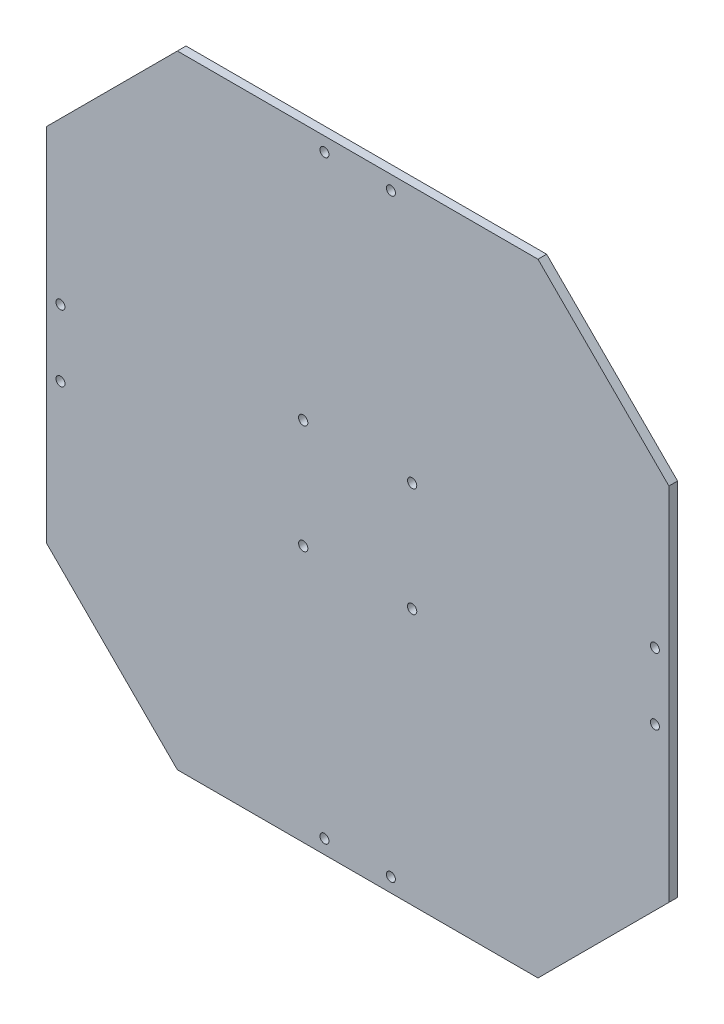
ISO-10303-21;
HEADER;
FILE_DESCRIPTION(('STEP AP214'),'2;1');
FILE_NAME('part.step','',(''),(''),'','','');
FILE_SCHEMA(('AUTOMOTIVE_DESIGN { 1 0 10303 214 1 1 1 1 }'));
ENDSEC;
DATA;
#1=APPLICATION_CONTEXT('core data for automotive mechanical design processes');
#2=APPLICATION_PROTOCOL_DEFINITION('international standard','automotive_design',2000,#1);
#3=PRODUCT_CONTEXT('',#1,'mechanical');
#4=PRODUCT('Part','Part','',(#3));
#5=PRODUCT_RELATED_PRODUCT_CATEGORY('part','',(#4));
#6=PRODUCT_DEFINITION_FORMATION('','',#4);
#7=PRODUCT_DEFINITION_CONTEXT('part definition',#1,'design');
#8=PRODUCT_DEFINITION('design','',#6,#7);
#9=PRODUCT_DEFINITION_SHAPE('','',#8);
#10=(LENGTH_UNIT() NAMED_UNIT(*) SI_UNIT(.MILLI.,.METRE.));
#11=(NAMED_UNIT(*) PLANE_ANGLE_UNIT() SI_UNIT($,.RADIAN.));
#12=(NAMED_UNIT(*) SI_UNIT($,.STERADIAN.) SOLID_ANGLE_UNIT());
#13=UNCERTAINTY_MEASURE_WITH_UNIT(LENGTH_MEASURE(1.E-05),#10,'distance_accuracy_value','');
#14=(GEOMETRIC_REPRESENTATION_CONTEXT(3) GLOBAL_UNCERTAINTY_ASSIGNED_CONTEXT((#13)) GLOBAL_UNIT_ASSIGNED_CONTEXT((#10,
#11,#12)) REPRESENTATION_CONTEXT('',''));
#15=CARTESIAN_POINT('',(0.,0.,0.));
#16=DIRECTION('',(0.,0.,1.));
#17=DIRECTION('',(1.,0.,0.));
#18=AXIS2_PLACEMENT_3D('',#15,#16,#17);
#19=CARTESIAN_POINT('',(174.562423095944,174.562423095942,3.175));
#20=DIRECTION('',(0.707106781186551,0.707106781186544,0.));
#21=DIRECTION('',(-0.707106781186544,0.707106781186551,0.));
#22=AXIS2_PLACEMENT_3D('',#19,#20,#21);
#23=PLANE('',#22);
#24=DIRECTION('',(0.707106781186544,-0.707106781186551,0.));
#25=VECTOR('',#24,1.);
#26=CARTESIAN_POINT('',(174.562423095944,174.562423095942,0.));
#27=LINE('',#26,#25);
#28=CARTESIAN_POINT('',(91.5767770113754,257.548069180511,0.));
#29=VERTEX_POINT('',#28);
#30=CARTESIAN_POINT('',(139.660038132061,209.464808059826,0.));
#31=VERTEX_POINT('',#30);
#32=EDGE_CURVE('E128',#29,#31,#27,.T.);
#33=ORIENTED_EDGE('',*,*,#32,.F.);
#34=DIRECTION('',(0.,0.,-1.));
#35=VECTOR('',#34,1.);
#36=CARTESIAN_POINT('',(91.5767770113754,257.548069180511,3.175));
#37=LINE('',#36,#35);
#38=CARTESIAN_POINT('',(91.5767770113754,257.548069180511,3.175));
#39=VERTEX_POINT('',#38);
#40=EDGE_CURVE('E11',#39,#29,#37,.T.);
#41=ORIENTED_EDGE('',*,*,#40,.F.);
#42=DIRECTION('',(0.707106781186544,-0.707106781186551,0.));
#43=VECTOR('',#42,1.);
#44=CARTESIAN_POINT('',(174.562423095944,174.562423095942,3.175));
#45=LINE('',#44,#43);
#46=CARTESIAN_POINT('',(139.660038132061,209.464808059826,3.175));
#47=VERTEX_POINT('',#46);
#48=EDGE_CURVE('E149',#39,#47,#45,.T.);
#49=ORIENTED_EDGE('',*,*,#48,.T.);
#50=DIRECTION('',(0.,0.,-1.));
#51=VECTOR('',#50,1.);
#52=CARTESIAN_POINT('',(139.660038132061,209.464808059826,3.175));
#53=LINE('',#52,#51);
#54=EDGE_CURVE('E85',#47,#31,#53,.T.);
#55=ORIENTED_EDGE('',*,*,#54,.T.);
#56=EDGE_LOOP('',(#33,#41,#49,#55));
#57=FACE_BOUND('',#56,.T.);
#58=ADVANCED_FACE('F35',(#57),#23,.T.);
#59=CARTESIAN_POINT('',(0.,257.548069180511,3.175));
#60=DIRECTION('',(0.,1.,0.));
#61=DIRECTION('',(0.,0.,1.));
#62=AXIS2_PLACEMENT_3D('',#59,#60,#61);
#63=PLANE('',#62);
#64=DIRECTION('',(1.,0.,0.));
#65=VECTOR('',#64,1.);
#66=CARTESIAN_POINT('',(0.,257.548069180511,0.));
#67=LINE('',#66,#65);
#68=CARTESIAN_POINT('',(-40.8567007472559,257.548069180511,0.));
#69=VERTEX_POINT('',#68);
#70=EDGE_CURVE('E131',#69,#29,#67,.T.);
#71=ORIENTED_EDGE('',*,*,#70,.F.);
#72=DIRECTION('',(0.,0.,-1.));
#73=VECTOR('',#72,1.);
#74=CARTESIAN_POINT('',(-40.8567007472559,257.548069180511,3.175));
#75=LINE('',#74,#73);
#76=CARTESIAN_POINT('',(-40.8567007472559,257.548069180511,3.175));
#77=VERTEX_POINT('',#76);
#78=EDGE_CURVE('E43',#77,#69,#75,.T.);
#79=ORIENTED_EDGE('',*,*,#78,.F.);
#80=DIRECTION('',(1.,0.,0.));
#81=VECTOR('',#80,1.);
#82=CARTESIAN_POINT('',(0.,257.548069180511,3.175));
#83=LINE('',#82,#81);
#84=EDGE_CURVE('E175',#77,#39,#83,.T.);
#85=ORIENTED_EDGE('',*,*,#84,.T.);
#86=ORIENTED_EDGE('',*,*,#40,.T.);
#87=EDGE_LOOP('',(#71,#79,#85,#86));
#88=FACE_BOUND('',#87,.T.);
#89=ADVANCED_FACE('F166',(#88),#63,.T.);
#90=CARTESIAN_POINT('',(-149.202384963885,149.202384963876,3.175));
#91=DIRECTION('',(-0.70710678118657,0.707106781186526,0.));
#92=DIRECTION('',(-0.707106781186526,-0.70710678118657,0.));
#93=AXIS2_PLACEMENT_3D('',#90,#91,#92);
#94=PLANE('',#93);
#95=DIRECTION('',(0.707106781186526,0.70710678118657,0.));
#96=VECTOR('',#95,1.);
#97=CARTESIAN_POINT('',(-149.202384963885,149.202384963876,0.));
#98=LINE('',#97,#96);
#99=CARTESIAN_POINT('',(-88.9399618679395,209.464808059825,0.));
#100=VERTEX_POINT('',#99);
#101=EDGE_CURVE('E135',#100,#69,#98,.T.);
#102=ORIENTED_EDGE('',*,*,#101,.F.);
#103=DIRECTION('',(0.,0.,-1.));
#104=VECTOR('',#103,1.);
#105=CARTESIAN_POINT('',(-88.9399618679395,209.464808059825,3.175));
#106=LINE('',#105,#104);
#107=CARTESIAN_POINT('',(-88.9399618679395,209.464808059825,3.175));
#108=VERTEX_POINT('',#107);
#109=EDGE_CURVE('E155',#108,#100,#106,.T.);
#110=ORIENTED_EDGE('',*,*,#109,.F.);
#111=DIRECTION('',(0.707106781186526,0.70710678118657,0.));
#112=VECTOR('',#111,1.);
#113=CARTESIAN_POINT('',(-149.202384963885,149.202384963876,3.175));
#114=LINE('',#113,#112);
#115=EDGE_CURVE('E162',#108,#77,#114,.T.);
#116=ORIENTED_EDGE('',*,*,#115,.T.);
#117=ORIENTED_EDGE('',*,*,#78,.T.);
#118=EDGE_LOOP('',(#102,#110,#116,#117));
#119=FACE_BOUND('',#118,.T.);
#120=ADVANCED_FACE('F160',(#119),#94,.T.);
#121=CARTESIAN_POINT('',(-88.9399618679395,0.,3.175));
#122=DIRECTION('',(-1.,0.,0.));
#123=DIRECTION('',(0.,0.,1.));
#124=AXIS2_PLACEMENT_3D('',#121,#122,#123);
#125=PLANE('',#124);
#126=DIRECTION('',(0.,1.,0.));
#127=VECTOR('',#126,1.);
#128=CARTESIAN_POINT('',(-88.9399618679395,0.,0.));
#129=LINE('',#128,#127);
#130=CARTESIAN_POINT('',(-88.9399618679395,77.0313303011962,0.));
#131=VERTEX_POINT('',#130);
#132=EDGE_CURVE('E138',#131,#100,#129,.T.);
#133=ORIENTED_EDGE('',*,*,#132,.F.);
#134=DIRECTION('',(0.,0.,-1.));
#135=VECTOR('',#134,1.);
#136=CARTESIAN_POINT('',(-88.9399618679395,77.0313303011962,3.175));
#137=LINE('',#136,#135);
#138=CARTESIAN_POINT('',(-88.9399618679395,77.0313303011962,3.175));
#139=VERTEX_POINT('',#138);
#140=EDGE_CURVE('E153',#139,#131,#137,.T.);
#141=ORIENTED_EDGE('',*,*,#140,.F.);
#142=DIRECTION('',(0.,1.,0.));
#143=VECTOR('',#142,1.);
#144=CARTESIAN_POINT('',(-88.9399618679395,0.,3.175));
#145=LINE('',#144,#143);
#146=EDGE_CURVE('E174',#139,#108,#145,.T.);
#147=ORIENTED_EDGE('',*,*,#146,.T.);
#148=ORIENTED_EDGE('',*,*,#109,.T.);
#149=EDGE_LOOP('',(#133,#141,#147,#148));
#150=FACE_BOUND('',#149,.T.);
#151=ADVANCED_FACE('F172',(#150),#125,.T.);
#152=CARTESIAN_POINT('',(-5.95431578337122,-5.95431578337128,3.175));
#153=DIRECTION('',(-0.707106781186544,-0.707106781186551,0.));
#154=DIRECTION('',(0.707106781186551,-0.707106781186544,0.));
#155=AXIS2_PLACEMENT_3D('',#152,#153,#154);
#156=PLANE('',#155);
#157=DIRECTION('',(-0.707106781186551,0.707106781186544,0.));
#158=VECTOR('',#157,1.);
#159=CARTESIAN_POINT('',(-5.95431578337122,-5.95431578337128,0.));
#160=LINE('',#159,#158);
#161=CARTESIAN_POINT('',(-40.856700747254,28.9480691805112,0.));
#162=VERTEX_POINT('',#161);
#163=EDGE_CURVE('E141',#162,#131,#160,.T.);
#164=ORIENTED_EDGE('',*,*,#163,.F.);
#165=DIRECTION('',(0.,0.,-1.));
#166=VECTOR('',#165,1.);
#167=CARTESIAN_POINT('',(-40.856700747254,28.9480691805112,3.175));
#168=LINE('',#167,#166);
#169=CARTESIAN_POINT('',(-40.856700747254,28.9480691805112,3.175));
#170=VERTEX_POINT('',#169);
#171=EDGE_CURVE('E121',#170,#162,#168,.T.);
#172=ORIENTED_EDGE('',*,*,#171,.F.);
#173=DIRECTION('',(-0.707106781186551,0.707106781186544,0.));
#174=VECTOR('',#173,1.);
#175=CARTESIAN_POINT('',(-5.95431578337122,-5.95431578337128,3.175));
#176=LINE('',#175,#174);
#177=EDGE_CURVE('E110',#170,#139,#176,.T.);
#178=ORIENTED_EDGE('',*,*,#177,.T.);
#179=ORIENTED_EDGE('',*,*,#140,.T.);
#180=EDGE_LOOP('',(#164,#172,#178,#179));
#181=FACE_BOUND('',#180,.T.);
#182=ADVANCED_FACE('F181',(#181),#156,.T.);
#183=CARTESIAN_POINT('',(0.,28.9480691805112,3.175));
#184=DIRECTION('',(0.,1.,0.));
#185=DIRECTION('',(0.,0.,1.));
#186=AXIS2_PLACEMENT_3D('',#183,#184,#185);
#187=PLANE('',#186);
#188=DIRECTION('',(1.,0.,0.));
#189=VECTOR('',#188,1.);
#190=CARTESIAN_POINT('',(0.,28.9480691805112,0.));
#191=LINE('',#190,#189);
#192=CARTESIAN_POINT('',(91.5767770113739,28.9480691805112,0.));
#193=VERTEX_POINT('',#192);
#194=EDGE_CURVE('E117',#162,#193,#191,.T.);
#195=ORIENTED_EDGE('',*,*,#194,.T.);
#196=DIRECTION('',(0.,0.,-1.));
#197=VECTOR('',#196,1.);
#198=CARTESIAN_POINT('',(91.5767770113739,28.9480691805112,3.175));
#199=LINE('',#198,#197);
#200=CARTESIAN_POINT('',(91.5767770113739,28.9480691805112,3.175));
#201=VERTEX_POINT('',#200);
#202=EDGE_CURVE('E114',#201,#193,#199,.T.);
#203=ORIENTED_EDGE('',*,*,#202,.F.);
#204=DIRECTION('',(1.,0.,0.));
#205=VECTOR('',#204,1.);
#206=CARTESIAN_POINT('',(0.,28.9480691805112,3.175));
#207=LINE('',#206,#205);
#208=EDGE_CURVE('E103',#170,#201,#207,.T.);
#209=ORIENTED_EDGE('',*,*,#208,.F.);
#210=ORIENTED_EDGE('',*,*,#171,.T.);
#211=EDGE_LOOP('',(#195,#203,#209,#210));
#212=FACE_BOUND('',#211,.T.);
#213=ADVANCED_FACE('F115',(#212),#187,.F.);
#214=CARTESIAN_POINT('',(31.3143539154286,-31.3143539154305,3.175));
#215=DIRECTION('',(0.707106781186526,-0.707106781186569,0.));
#216=DIRECTION('',(0.707106781186569,0.707106781186526,0.));
#217=AXIS2_PLACEMENT_3D('',#214,#215,#216);
#218=PLANE('',#217);
#219=DIRECTION('',(-0.707106781186569,-0.707106781186526,0.));
#220=VECTOR('',#219,1.);
#221=CARTESIAN_POINT('',(31.3143539154286,-31.3143539154305,0.));
#222=LINE('',#221,#220);
#223=CARTESIAN_POINT('',(139.660038132061,77.0313303011948,0.));
#224=VERTEX_POINT('',#223);
#225=EDGE_CURVE('E145',#224,#193,#222,.T.);
#226=ORIENTED_EDGE('',*,*,#225,.F.);
#227=DIRECTION('',(0.,0.,-1.));
#228=VECTOR('',#227,1.);
#229=CARTESIAN_POINT('',(139.660038132061,77.0313303011948,3.175));
#230=LINE('',#229,#228);
#231=CARTESIAN_POINT('',(139.660038132061,77.0313303011948,3.175));
#232=VERTEX_POINT('',#231);
#233=EDGE_CURVE('E78',#232,#224,#230,.T.);
#234=ORIENTED_EDGE('',*,*,#233,.F.);
#235=DIRECTION('',(-0.707106781186569,-0.707106781186526,0.));
#236=VECTOR('',#235,1.);
#237=CARTESIAN_POINT('',(31.3143539154286,-31.3143539154305,3.175));
#238=LINE('',#237,#236);
#239=EDGE_CURVE('E107',#232,#201,#238,.T.);
#240=ORIENTED_EDGE('',*,*,#239,.T.);
#241=ORIENTED_EDGE('',*,*,#202,.T.);
#242=EDGE_LOOP('',(#226,#234,#240,#241));
#243=FACE_BOUND('',#242,.T.);
#244=ADVANCED_FACE('F123',(#243),#218,.T.);
#245=CARTESIAN_POINT('',(139.66003813206,0.,3.175));
#246=DIRECTION('',(-1.,0.,0.));
#247=DIRECTION('',(0.,0.,1.));
#248=AXIS2_PLACEMENT_3D('',#245,#246,#247);
#249=PLANE('',#248);
#250=DIRECTION('',(0.,1.,0.));
#251=VECTOR('',#250,1.);
#252=CARTESIAN_POINT('',(139.66003813206,0.,0.));
#253=LINE('',#252,#251);
#254=EDGE_CURVE('E147',#224,#31,#253,.T.);
#255=ORIENTED_EDGE('',*,*,#254,.T.);
#256=ORIENTED_EDGE('',*,*,#54,.F.);
#257=DIRECTION('',(0.,1.,0.));
#258=VECTOR('',#257,1.);
#259=CARTESIAN_POINT('',(139.66003813206,0.,3.175));
#260=LINE('',#259,#258);
#261=EDGE_CURVE('E51',#232,#47,#260,.T.);
#262=ORIENTED_EDGE('',*,*,#261,.F.);
#263=ORIENTED_EDGE('',*,*,#233,.T.);
#264=EDGE_LOOP('',(#255,#256,#262,#263));
#265=FACE_BOUND('',#264,.T.);
#266=ADVANCED_FACE('F182',(#265),#249,.F.);
#267=CARTESIAN_POINT('',(0.,0.,3.175));
#268=DIRECTION('',(0.,0.,1.));
#269=DIRECTION('',(1.,0.,0.));
#270=AXIS2_PLACEMENT_3D('',#267,#268,#269);
#271=PLANE('',#270);
#272=CARTESIAN_POINT('',(134.503838132061,155.448069180517,3.175));
#273=DIRECTION('',(0.,0.,1.));
#274=DIRECTION('',(1.,0.,0.));
#275=AXIS2_PLACEMENT_3D('',#272,#273,#274);
#276=CIRCLE('',#275,1.65099999999999);
#277=CARTESIAN_POINT('',(136.154838132061,155.448069180517,3.175));
#278=VERTEX_POINT('',#277);
#279=EDGE_CURVE('E218',#278,#278,#276,.T.);
#280=ORIENTED_EDGE('',*,*,#279,.F.);
#281=EDGE_LOOP('',(#280));
#282=FACE_BOUND('',#281,.T.);
#283=CARTESIAN_POINT('',(134.503838132061,131.048069180517,3.175));
#284=DIRECTION('',(0.,0.,1.));
#285=DIRECTION('',(1.,0.,0.));
#286=AXIS2_PLACEMENT_3D('',#283,#284,#285);
#287=CIRCLE('',#286,1.65099999999999);
#288=CARTESIAN_POINT('',(136.154838132061,131.048069180517,3.175));
#289=VERTEX_POINT('',#288);
#290=EDGE_CURVE('E217',#289,#289,#287,.T.);
#291=ORIENTED_EDGE('',*,*,#290,.F.);
#292=EDGE_LOOP('',(#291));
#293=FACE_BOUND('',#292,.T.);
#294=CARTESIAN_POINT('',(37.5600381320667,34.1042691805105,3.175));
#295=DIRECTION('',(0.,0.,1.));
#296=DIRECTION('',(1.,0.,0.));
#297=AXIS2_PLACEMENT_3D('',#294,#295,#296);
#298=CIRCLE('',#297,1.651);
#299=CARTESIAN_POINT('',(39.2110381320667,34.1042691805105,3.175));
#300=VERTEX_POINT('',#299);
#301=EDGE_CURVE('E224',#300,#300,#298,.T.);
#302=ORIENTED_EDGE('',*,*,#301,.F.);
#303=EDGE_LOOP('',(#302));
#304=FACE_BOUND('',#303,.T.);
#305=CARTESIAN_POINT('',(13.1600381320667,34.1042691805105,3.175));
#306=DIRECTION('',(0.,0.,1.));
#307=DIRECTION('',(1.,0.,0.));
#308=AXIS2_PLACEMENT_3D('',#305,#306,#307);
#309=CIRCLE('',#308,1.651);
#310=CARTESIAN_POINT('',(14.8110381320667,34.1042691805105,3.175));
#311=VERTEX_POINT('',#310);
#312=EDGE_CURVE('E230',#311,#311,#309,.T.);
#313=ORIENTED_EDGE('',*,*,#312,.F.);
#314=EDGE_LOOP('',(#313));
#315=FACE_BOUND('',#314,.T.);
#316=CARTESIAN_POINT('',(-83.7837618679403,131.048069180505,3.175));
#317=DIRECTION('',(0.,0.,1.));
#318=DIRECTION('',(1.,0.,0.));
#319=AXIS2_PLACEMENT_3D('',#316,#317,#318);
#320=CIRCLE('',#319,1.65099999999999);
#321=CARTESIAN_POINT('',(-82.1327618679403,131.048069180505,3.175));
#322=VERTEX_POINT('',#321);
#323=EDGE_CURVE('E236',#322,#322,#320,.T.);
#324=ORIENTED_EDGE('',*,*,#323,.F.);
#325=EDGE_LOOP('',(#324));
#326=FACE_BOUND('',#325,.T.);
#327=CARTESIAN_POINT('',(-83.7837618679403,155.448069180505,3.175));
#328=DIRECTION('',(0.,0.,1.));
#329=DIRECTION('',(1.,0.,0.));
#330=AXIS2_PLACEMENT_3D('',#327,#328,#329);
#331=CIRCLE('',#330,1.65099999999999);
#332=CARTESIAN_POINT('',(-82.1327618679403,155.448069180505,3.175));
#333=VERTEX_POINT('',#332);
#334=EDGE_CURVE('E242',#333,#333,#331,.T.);
#335=ORIENTED_EDGE('',*,*,#334,.F.);
#336=EDGE_LOOP('',(#335));
#337=FACE_BOUND('',#336,.T.);
#338=CARTESIAN_POINT('',(13.1600381320542,252.391869180512,3.175));
#339=DIRECTION('',(0.,0.,1.));
#340=DIRECTION('',(1.,0.,0.));
#341=AXIS2_PLACEMENT_3D('',#338,#339,#340);
#342=CIRCLE('',#341,1.65100000000001);
#343=CARTESIAN_POINT('',(14.8110381320542,252.391869180512,3.175));
#344=VERTEX_POINT('',#343);
#345=EDGE_CURVE('E248',#344,#344,#342,.T.);
#346=ORIENTED_EDGE('',*,*,#345,.F.);
#347=EDGE_LOOP('',(#346));
#348=FACE_BOUND('',#347,.T.);
#349=CARTESIAN_POINT('',(37.5600381320542,252.391869180512,3.175));
#350=DIRECTION('',(0.,0.,1.));
#351=DIRECTION('',(1.,0.,0.));
#352=AXIS2_PLACEMENT_3D('',#349,#350,#351);
#353=CIRCLE('',#352,1.65100000000001);
#354=CARTESIAN_POINT('',(39.2110381320542,252.391869180512,3.175));
#355=VERTEX_POINT('',#354);
#356=EDGE_CURVE('E210',#355,#355,#353,.T.);
#357=ORIENTED_EDGE('',*,*,#356,.F.);
#358=EDGE_LOOP('',(#357));
#359=FACE_BOUND('',#358,.T.);
#360=CARTESIAN_POINT('',(5.36003813205978,163.24806918051,3.175));
#361=DIRECTION('',(0.,0.,1.));
#362=DIRECTION('',(1.,0.,0.));
#363=AXIS2_PLACEMENT_3D('',#360,#361,#362);
#364=CIRCLE('',#363,1.69999999999999);
#365=CARTESIAN_POINT('',(7.06003813205977,163.24806918051,3.175));
#366=VERTEX_POINT('',#365);
#367=EDGE_CURVE('E204',#366,#366,#364,.T.);
#368=ORIENTED_EDGE('',*,*,#367,.F.);
#369=EDGE_LOOP('',(#368));
#370=FACE_BOUND('',#369,.T.);
#371=CARTESIAN_POINT('',(45.3600381320598,123.24806918051,3.175));
#372=DIRECTION('',(0.,0.,1.));
#373=DIRECTION('',(1.,0.,0.));
#374=AXIS2_PLACEMENT_3D('',#371,#372,#373);
#375=CIRCLE('',#374,1.69999999999999);
#376=CARTESIAN_POINT('',(47.0600381320598,123.24806918051,3.175));
#377=VERTEX_POINT('',#376);
#378=EDGE_CURVE('E198',#377,#377,#375,.T.);
#379=ORIENTED_EDGE('',*,*,#378,.F.);
#380=EDGE_LOOP('',(#379));
#381=FACE_BOUND('',#380,.T.);
#382=CARTESIAN_POINT('',(45.3600381320598,163.24806918051,3.175));
#383=DIRECTION('',(0.,0.,1.));
#384=DIRECTION('',(1.,0.,0.));
#385=AXIS2_PLACEMENT_3D('',#382,#383,#384);
#386=CIRCLE('',#385,1.69999999999999);
#387=CARTESIAN_POINT('',(47.0600381320598,163.24806918051,3.175));
#388=VERTEX_POINT('',#387);
#389=EDGE_CURVE('E192',#388,#388,#386,.T.);
#390=ORIENTED_EDGE('',*,*,#389,.F.);
#391=EDGE_LOOP('',(#390));
#392=FACE_BOUND('',#391,.T.);
#393=CARTESIAN_POINT('',(5.36003813205978,123.24806918051,3.175));
#394=DIRECTION('',(0.,0.,1.));
#395=DIRECTION('',(1.,0.,0.));
#396=AXIS2_PLACEMENT_3D('',#393,#394,#395);
#397=CIRCLE('',#396,1.69999999999999);
#398=CARTESIAN_POINT('',(7.06003813205977,123.24806918051,3.175));
#399=VERTEX_POINT('',#398);
#400=EDGE_CURVE('E186',#399,#399,#397,.T.);
#401=ORIENTED_EDGE('',*,*,#400,.F.);
#402=EDGE_LOOP('',(#401));
#403=FACE_BOUND('',#402,.T.);
#404=ORIENTED_EDGE('',*,*,#48,.F.);
#405=ORIENTED_EDGE('',*,*,#84,.F.);
#406=ORIENTED_EDGE('',*,*,#115,.F.);
#407=ORIENTED_EDGE('',*,*,#146,.F.);
#408=ORIENTED_EDGE('',*,*,#177,.F.);
#409=ORIENTED_EDGE('',*,*,#208,.T.);
#410=ORIENTED_EDGE('',*,*,#239,.F.);
#411=ORIENTED_EDGE('',*,*,#261,.T.);
#412=EDGE_LOOP('',(#404,#405,#406,#407,#408,#409,#410,#411));
#413=FACE_BOUND('',#412,.T.);
#414=ADVANCED_FACE('F105',(#282,#293,#304,#315,#326,#337,#348,#359,#370,#381,#392,#403,#413),
#271,.T.);
#415=CARTESIAN_POINT('',(0.,0.,0.));
#416=DIRECTION('',(0.,0.,1.));
#417=DIRECTION('',(1.,0.,0.));
#418=AXIS2_PLACEMENT_3D('',#415,#416,#417);
#419=PLANE('',#418);
#420=CARTESIAN_POINT('',(134.503838132061,155.448069180517,0.));
#421=DIRECTION('',(0.,0.,1.));
#422=DIRECTION('',(1.,0.,0.));
#423=AXIS2_PLACEMENT_3D('',#420,#421,#422);
#424=CIRCLE('',#423,1.65099999999999);
#425=CARTESIAN_POINT('',(136.154838132061,155.448069180517,0.));
#426=VERTEX_POINT('',#425);
#427=EDGE_CURVE('E214',#426,#426,#424,.F.);
#428=ORIENTED_EDGE('',*,*,#427,.F.);
#429=EDGE_LOOP('',(#428));
#430=FACE_BOUND('',#429,.T.);
#431=CARTESIAN_POINT('',(134.503838132061,131.048069180517,0.));
#432=DIRECTION('',(0.,0.,1.));
#433=DIRECTION('',(1.,0.,0.));
#434=AXIS2_PLACEMENT_3D('',#431,#432,#433);
#435=CIRCLE('',#434,1.65099999999999);
#436=CARTESIAN_POINT('',(136.154838132061,131.048069180517,0.));
#437=VERTEX_POINT('',#436);
#438=EDGE_CURVE('E221',#437,#437,#435,.F.);
#439=ORIENTED_EDGE('',*,*,#438,.F.);
#440=EDGE_LOOP('',(#439));
#441=FACE_BOUND('',#440,.T.);
#442=CARTESIAN_POINT('',(37.5600381320667,34.1042691805105,0.));
#443=DIRECTION('',(0.,0.,1.));
#444=DIRECTION('',(1.,0.,0.));
#445=AXIS2_PLACEMENT_3D('',#442,#443,#444);
#446=CIRCLE('',#445,1.651);
#447=CARTESIAN_POINT('',(39.2110381320667,34.1042691805105,0.));
#448=VERTEX_POINT('',#447);
#449=EDGE_CURVE('E227',#448,#448,#446,.F.);
#450=ORIENTED_EDGE('',*,*,#449,.F.);
#451=EDGE_LOOP('',(#450));
#452=FACE_BOUND('',#451,.T.);
#453=CARTESIAN_POINT('',(13.1600381320667,34.1042691805105,0.));
#454=DIRECTION('',(0.,0.,1.));
#455=DIRECTION('',(1.,0.,0.));
#456=AXIS2_PLACEMENT_3D('',#453,#454,#455);
#457=CIRCLE('',#456,1.651);
#458=CARTESIAN_POINT('',(14.8110381320667,34.1042691805105,0.));
#459=VERTEX_POINT('',#458);
#460=EDGE_CURVE('E233',#459,#459,#457,.F.);
#461=ORIENTED_EDGE('',*,*,#460,.F.);
#462=EDGE_LOOP('',(#461));
#463=FACE_BOUND('',#462,.T.);
#464=CARTESIAN_POINT('',(-83.7837618679403,131.048069180505,0.));
#465=DIRECTION('',(0.,0.,1.));
#466=DIRECTION('',(1.,0.,0.));
#467=AXIS2_PLACEMENT_3D('',#464,#465,#466);
#468=CIRCLE('',#467,1.65099999999999);
#469=CARTESIAN_POINT('',(-82.1327618679403,131.048069180505,0.));
#470=VERTEX_POINT('',#469);
#471=EDGE_CURVE('E239',#470,#470,#468,.F.);
#472=ORIENTED_EDGE('',*,*,#471,.F.);
#473=EDGE_LOOP('',(#472));
#474=FACE_BOUND('',#473,.T.);
#475=CARTESIAN_POINT('',(-83.7837618679403,155.448069180505,0.));
#476=DIRECTION('',(0.,0.,1.));
#477=DIRECTION('',(1.,0.,0.));
#478=AXIS2_PLACEMENT_3D('',#475,#476,#477);
#479=CIRCLE('',#478,1.65099999999999);
#480=CARTESIAN_POINT('',(-82.1327618679403,155.448069180505,0.));
#481=VERTEX_POINT('',#480);
#482=EDGE_CURVE('E245',#481,#481,#479,.F.);
#483=ORIENTED_EDGE('',*,*,#482,.F.);
#484=EDGE_LOOP('',(#483));
#485=FACE_BOUND('',#484,.T.);
#486=CARTESIAN_POINT('',(13.1600381320542,252.391869180512,0.));
#487=DIRECTION('',(0.,0.,1.));
#488=DIRECTION('',(1.,0.,0.));
#489=AXIS2_PLACEMENT_3D('',#486,#487,#488);
#490=CIRCLE('',#489,1.65100000000001);
#491=CARTESIAN_POINT('',(14.8110381320542,252.391869180512,0.));
#492=VERTEX_POINT('',#491);
#493=EDGE_CURVE('E213',#492,#492,#490,.F.);
#494=ORIENTED_EDGE('',*,*,#493,.F.);
#495=EDGE_LOOP('',(#494));
#496=FACE_BOUND('',#495,.T.);
#497=CARTESIAN_POINT('',(37.5600381320542,252.391869180512,0.));
#498=DIRECTION('',(0.,0.,1.));
#499=DIRECTION('',(1.,0.,0.));
#500=AXIS2_PLACEMENT_3D('',#497,#498,#499);
#501=CIRCLE('',#500,1.65100000000001);
#502=CARTESIAN_POINT('',(39.2110381320542,252.391869180512,0.));
#503=VERTEX_POINT('',#502);
#504=EDGE_CURVE('E207',#503,#503,#501,.F.);
#505=ORIENTED_EDGE('',*,*,#504,.F.);
#506=EDGE_LOOP('',(#505));
#507=FACE_BOUND('',#506,.T.);
#508=CARTESIAN_POINT('',(5.36003813205978,163.24806918051,0.));
#509=DIRECTION('',(0.,0.,1.));
#510=DIRECTION('',(1.,0.,0.));
#511=AXIS2_PLACEMENT_3D('',#508,#509,#510);
#512=CIRCLE('',#511,1.69999999999999);
#513=CARTESIAN_POINT('',(7.06003813205978,163.24806918051,0.));
#514=VERTEX_POINT('',#513);
#515=EDGE_CURVE('E201',#514,#514,#512,.T.);
#516=ORIENTED_EDGE('',*,*,#515,.T.);
#517=EDGE_LOOP('',(#516));
#518=FACE_BOUND('',#517,.T.);
#519=CARTESIAN_POINT('',(45.3600381320598,123.24806918051,0.));
#520=DIRECTION('',(0.,0.,1.));
#521=DIRECTION('',(1.,0.,0.));
#522=AXIS2_PLACEMENT_3D('',#519,#520,#521);
#523=CIRCLE('',#522,1.69999999999999);
#524=CARTESIAN_POINT('',(47.0600381320598,123.24806918051,0.));
#525=VERTEX_POINT('',#524);
#526=EDGE_CURVE('E195',#525,#525,#523,.T.);
#527=ORIENTED_EDGE('',*,*,#526,.T.);
#528=EDGE_LOOP('',(#527));
#529=FACE_BOUND('',#528,.T.);
#530=CARTESIAN_POINT('',(45.3600381320598,163.24806918051,0.));
#531=DIRECTION('',(0.,0.,1.));
#532=DIRECTION('',(1.,0.,0.));
#533=AXIS2_PLACEMENT_3D('',#530,#531,#532);
#534=CIRCLE('',#533,1.69999999999999);
#535=CARTESIAN_POINT('',(47.0600381320598,163.24806918051,0.));
#536=VERTEX_POINT('',#535);
#537=EDGE_CURVE('E189',#536,#536,#534,.T.);
#538=ORIENTED_EDGE('',*,*,#537,.T.);
#539=EDGE_LOOP('',(#538));
#540=FACE_BOUND('',#539,.T.);
#541=CARTESIAN_POINT('',(5.36003813205978,123.24806918051,0.));
#542=DIRECTION('',(0.,0.,1.));
#543=DIRECTION('',(1.,0.,0.));
#544=AXIS2_PLACEMENT_3D('',#541,#542,#543);
#545=CIRCLE('',#544,1.69999999999999);
#546=CARTESIAN_POINT('',(7.06003813205978,123.24806918051,0.));
#547=VERTEX_POINT('',#546);
#548=EDGE_CURVE('E132',#547,#547,#545,.T.);
#549=ORIENTED_EDGE('',*,*,#548,.T.);
#550=EDGE_LOOP('',(#549));
#551=FACE_BOUND('',#550,.T.);
#552=ORIENTED_EDGE('',*,*,#32,.T.);
#553=ORIENTED_EDGE('',*,*,#254,.F.);
#554=ORIENTED_EDGE('',*,*,#225,.T.);
#555=ORIENTED_EDGE('',*,*,#194,.F.);
#556=ORIENTED_EDGE('',*,*,#163,.T.);
#557=ORIENTED_EDGE('',*,*,#132,.T.);
#558=ORIENTED_EDGE('',*,*,#101,.T.);
#559=ORIENTED_EDGE('',*,*,#70,.T.);
#560=EDGE_LOOP('',(#552,#553,#554,#555,#556,#557,#558,#559));
#561=FACE_BOUND('',#560,.T.);
#562=ADVANCED_FACE('F168',(#430,#441,#452,#463,#474,#485,#496,#507,#518,#529,#540,#551,#561),
#419,.F.);
#563=CARTESIAN_POINT('',(5.36003813205978,123.24806918051,3.175));
#564=DIRECTION('',(0.,0.,1.));
#565=DIRECTION('',(1.,0.,0.));
#566=AXIS2_PLACEMENT_3D('',#563,#564,#565);
#567=CYLINDRICAL_SURFACE('',#566,1.69999999999999);
#568=ORIENTED_EDGE('',*,*,#548,.F.);
#569=EDGE_LOOP('',(#568));
#570=FACE_BOUND('',#569,.T.);
#571=ORIENTED_EDGE('',*,*,#400,.T.);
#572=EDGE_LOOP('',(#571));
#573=FACE_BOUND('',#572,.T.);
#574=ADVANCED_FACE('F272',(#570,#573),#567,.F.);
#575=CARTESIAN_POINT('',(45.3600381320598,163.24806918051,3.175));
#576=DIRECTION('',(0.,0.,1.));
#577=DIRECTION('',(1.,0.,0.));
#578=AXIS2_PLACEMENT_3D('',#575,#576,#577);
#579=CYLINDRICAL_SURFACE('',#578,1.69999999999999);
#580=ORIENTED_EDGE('',*,*,#537,.F.);
#581=EDGE_LOOP('',(#580));
#582=FACE_BOUND('',#581,.T.);
#583=ORIENTED_EDGE('',*,*,#389,.T.);
#584=EDGE_LOOP('',(#583));
#585=FACE_BOUND('',#584,.T.);
#586=ADVANCED_FACE('F274',(#582,#585),#579,.F.);
#587=CARTESIAN_POINT('',(45.3600381320598,123.24806918051,3.175));
#588=DIRECTION('',(0.,0.,1.));
#589=DIRECTION('',(1.,0.,0.));
#590=AXIS2_PLACEMENT_3D('',#587,#588,#589);
#591=CYLINDRICAL_SURFACE('',#590,1.69999999999999);
#592=ORIENTED_EDGE('',*,*,#526,.F.);
#593=EDGE_LOOP('',(#592));
#594=FACE_BOUND('',#593,.T.);
#595=ORIENTED_EDGE('',*,*,#378,.T.);
#596=EDGE_LOOP('',(#595));
#597=FACE_BOUND('',#596,.T.);
#598=ADVANCED_FACE('F281',(#594,#597),#591,.F.);
#599=CARTESIAN_POINT('',(5.36003813205978,163.24806918051,3.175));
#600=DIRECTION('',(0.,0.,1.));
#601=DIRECTION('',(1.,0.,0.));
#602=AXIS2_PLACEMENT_3D('',#599,#600,#601);
#603=CYLINDRICAL_SURFACE('',#602,1.69999999999999);
#604=ORIENTED_EDGE('',*,*,#515,.F.);
#605=EDGE_LOOP('',(#604));
#606=FACE_BOUND('',#605,.T.);
#607=ORIENTED_EDGE('',*,*,#367,.T.);
#608=EDGE_LOOP('',(#607));
#609=FACE_BOUND('',#608,.T.);
#610=ADVANCED_FACE('F329',(#606,#609),#603,.F.);
#611=CARTESIAN_POINT('',(37.5600381320542,252.391869180512,-4.66973318295599));
#612=DIRECTION('',(0.,0.,1.));
#613=DIRECTION('',(1.,0.,0.));
#614=AXIS2_PLACEMENT_3D('',#611,#612,#613);
#615=CYLINDRICAL_SURFACE('',#614,1.65100000000001);
#616=ORIENTED_EDGE('',*,*,#504,.T.);
#617=EDGE_LOOP('',(#616));
#618=FACE_BOUND('',#617,.T.);
#619=ORIENTED_EDGE('',*,*,#356,.T.);
#620=EDGE_LOOP('',(#619));
#621=FACE_BOUND('',#620,.T.);
#622=ADVANCED_FACE('F324',(#618,#621),#615,.F.);
#623=CARTESIAN_POINT('',(13.1600381320542,252.391869180512,-4.66973318295599));
#624=DIRECTION('',(0.,0.,1.));
#625=DIRECTION('',(1.,0.,0.));
#626=AXIS2_PLACEMENT_3D('',#623,#624,#625);
#627=CYLINDRICAL_SURFACE('',#626,1.65100000000001);
#628=ORIENTED_EDGE('',*,*,#493,.T.);
#629=EDGE_LOOP('',(#628));
#630=FACE_BOUND('',#629,.T.);
#631=ORIENTED_EDGE('',*,*,#345,.T.);
#632=EDGE_LOOP('',(#631));
#633=FACE_BOUND('',#632,.T.);
#634=ADVANCED_FACE('F256',(#630,#633),#627,.F.);
#635=CARTESIAN_POINT('',(-83.7837618679403,155.448069180505,-4.66973318295599));
#636=DIRECTION('',(0.,0.,1.));
#637=DIRECTION('',(1.,0.,0.));
#638=AXIS2_PLACEMENT_3D('',#635,#636,#637);
#639=CYLINDRICAL_SURFACE('',#638,1.65099999999999);
#640=ORIENTED_EDGE('',*,*,#482,.T.);
#641=EDGE_LOOP('',(#640));
#642=FACE_BOUND('',#641,.T.);
#643=ORIENTED_EDGE('',*,*,#334,.T.);
#644=EDGE_LOOP('',(#643));
#645=FACE_BOUND('',#644,.T.);
#646=ADVANCED_FACE('F341',(#642,#645),#639,.F.);
#647=CARTESIAN_POINT('',(-83.7837618679403,131.048069180505,-4.66973318295599));
#648=DIRECTION('',(0.,0.,1.));
#649=DIRECTION('',(1.,0.,0.));
#650=AXIS2_PLACEMENT_3D('',#647,#648,#649);
#651=CYLINDRICAL_SURFACE('',#650,1.65099999999999);
#652=ORIENTED_EDGE('',*,*,#471,.T.);
#653=EDGE_LOOP('',(#652));
#654=FACE_BOUND('',#653,.T.);
#655=ORIENTED_EDGE('',*,*,#323,.T.);
#656=EDGE_LOOP('',(#655));
#657=FACE_BOUND('',#656,.T.);
#658=ADVANCED_FACE('F351',(#654,#657),#651,.F.);
#659=CARTESIAN_POINT('',(13.1600381320667,34.1042691805105,-4.66973318295599));
#660=DIRECTION('',(0.,0.,1.));
#661=DIRECTION('',(1.,0.,0.));
#662=AXIS2_PLACEMENT_3D('',#659,#660,#661);
#663=CYLINDRICAL_SURFACE('',#662,1.651);
#664=ORIENTED_EDGE('',*,*,#460,.T.);
#665=EDGE_LOOP('',(#664));
#666=FACE_BOUND('',#665,.T.);
#667=ORIENTED_EDGE('',*,*,#312,.T.);
#668=EDGE_LOOP('',(#667));
#669=FACE_BOUND('',#668,.T.);
#670=ADVANCED_FACE('F361',(#666,#669),#663,.F.);
#671=CARTESIAN_POINT('',(37.5600381320667,34.1042691805105,-4.66973318295599));
#672=DIRECTION('',(0.,0.,1.));
#673=DIRECTION('',(1.,0.,0.));
#674=AXIS2_PLACEMENT_3D('',#671,#672,#673);
#675=CYLINDRICAL_SURFACE('',#674,1.651);
#676=ORIENTED_EDGE('',*,*,#449,.T.);
#677=EDGE_LOOP('',(#676));
#678=FACE_BOUND('',#677,.T.);
#679=ORIENTED_EDGE('',*,*,#301,.T.);
#680=EDGE_LOOP('',(#679));
#681=FACE_BOUND('',#680,.T.);
#682=ADVANCED_FACE('F371',(#678,#681),#675,.F.);
#683=CARTESIAN_POINT('',(134.503838132061,131.048069180517,-4.66973318295599));
#684=DIRECTION('',(0.,0.,1.));
#685=DIRECTION('',(1.,0.,0.));
#686=AXIS2_PLACEMENT_3D('',#683,#684,#685);
#687=CYLINDRICAL_SURFACE('',#686,1.65099999999999);
#688=ORIENTED_EDGE('',*,*,#438,.T.);
#689=EDGE_LOOP('',(#688));
#690=FACE_BOUND('',#689,.T.);
#691=ORIENTED_EDGE('',*,*,#290,.T.);
#692=EDGE_LOOP('',(#691));
#693=FACE_BOUND('',#692,.T.);
#694=ADVANCED_FACE('F381',(#690,#693),#687,.F.);
#695=CARTESIAN_POINT('',(134.503838132061,155.448069180517,-4.66973318295599));
#696=DIRECTION('',(0.,0.,1.));
#697=DIRECTION('',(1.,0.,0.));
#698=AXIS2_PLACEMENT_3D('',#695,#696,#697);
#699=CYLINDRICAL_SURFACE('',#698,1.65099999999999);
#700=ORIENTED_EDGE('',*,*,#427,.T.);
#701=EDGE_LOOP('',(#700));
#702=FACE_BOUND('',#701,.T.);
#703=ORIENTED_EDGE('',*,*,#279,.T.);
#704=EDGE_LOOP('',(#703));
#705=FACE_BOUND('',#704,.T.);
#706=ADVANCED_FACE('F391',(#702,#705),#699,.F.);
#707=CLOSED_SHELL('',(#58,#89,#120,#151,#182,#213,#244,#266,#414,#562,#574,#586,#598,#610,#622,
#634,#646,#658,#670,#682,#694,#706));
#708=MANIFOLD_SOLID_BREP('B2',#707);
#709=ADVANCED_BREP_SHAPE_REPRESENTATION('',(#18,#708),#14);
#710=SHAPE_DEFINITION_REPRESENTATION(#9,#709);
ENDSEC;
END-ISO-10303-21;
